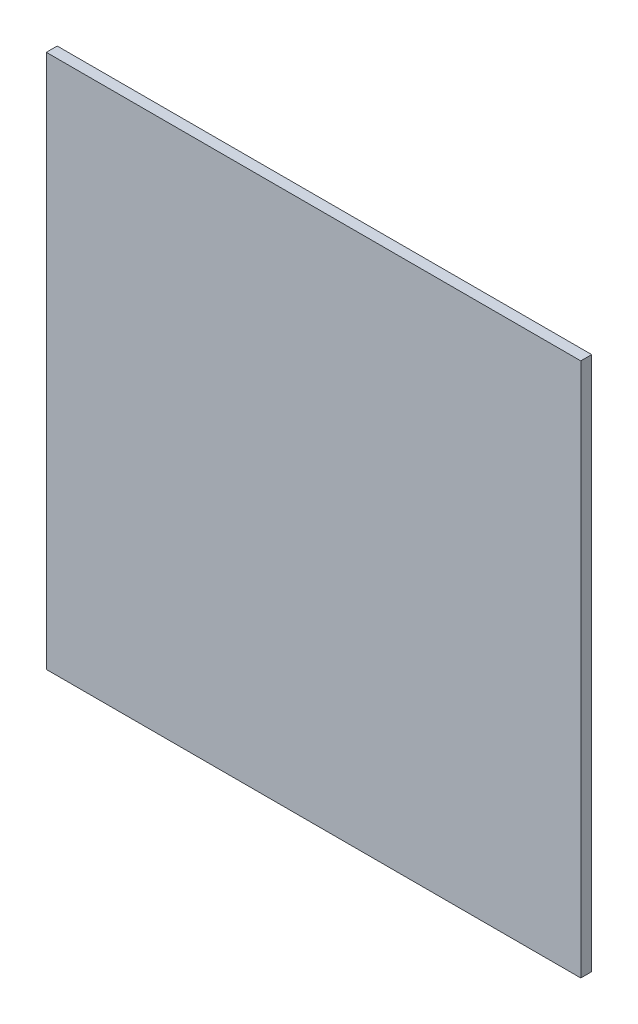
ISO-10303-21;
HEADER;
FILE_DESCRIPTION(('STEP AP214'),'2;1');
FILE_NAME('part.step','',(''),(''),'','','');
FILE_SCHEMA(('AUTOMOTIVE_DESIGN { 1 0 10303 214 1 1 1 1 }'));
ENDSEC;
DATA;
#1=APPLICATION_CONTEXT('core data for automotive mechanical design processes');
#2=APPLICATION_PROTOCOL_DEFINITION('international standard','automotive_design',2000,#1);
#3=PRODUCT_CONTEXT('',#1,'mechanical');
#4=PRODUCT('Part','Part','',(#3));
#5=PRODUCT_RELATED_PRODUCT_CATEGORY('part','',(#4));
#6=PRODUCT_DEFINITION_FORMATION('','',#4);
#7=PRODUCT_DEFINITION_CONTEXT('part definition',#1,'design');
#8=PRODUCT_DEFINITION('design','',#6,#7);
#9=PRODUCT_DEFINITION_SHAPE('','',#8);
#10=(LENGTH_UNIT() NAMED_UNIT(*) SI_UNIT(.MILLI.,.METRE.));
#11=(NAMED_UNIT(*) PLANE_ANGLE_UNIT() SI_UNIT($,.RADIAN.));
#12=(NAMED_UNIT(*) SI_UNIT($,.STERADIAN.) SOLID_ANGLE_UNIT());
#13=UNCERTAINTY_MEASURE_WITH_UNIT(LENGTH_MEASURE(1.E-05),#10,'distance_accuracy_value','');
#14=(GEOMETRIC_REPRESENTATION_CONTEXT(3) GLOBAL_UNCERTAINTY_ASSIGNED_CONTEXT((#13)) GLOBAL_UNIT_ASSIGNED_CONTEXT((#10,
#11,#12)) REPRESENTATION_CONTEXT('',''));
#15=CARTESIAN_POINT('',(0.,0.,0.));
#16=DIRECTION('',(0.,0.,1.));
#17=DIRECTION('',(1.,0.,0.));
#18=AXIS2_PLACEMENT_3D('',#15,#16,#17);
#19=CARTESIAN_POINT('',(2.45,-2.45,0.1));
#20=DIRECTION('',(-1.,0.,0.));
#21=DIRECTION('',(0.,0.,1.));
#22=AXIS2_PLACEMENT_3D('',#19,#20,#21);
#23=PLANE('',#22);
#24=DIRECTION('',(0.,1.,0.));
#25=VECTOR('',#24,1.);
#26=CARTESIAN_POINT('',(2.45,-2.45,0.));
#27=LINE('',#26,#25);
#28=CARTESIAN_POINT('',(2.45,-2.45,0.));
#29=VERTEX_POINT('',#28);
#30=CARTESIAN_POINT('',(2.45,2.45,0.));
#31=VERTEX_POINT('',#30);
#32=EDGE_CURVE('E97',#29,#31,#27,.T.);
#33=ORIENTED_EDGE('',*,*,#32,.T.);
#34=DIRECTION('',(0.,0.,-1.));
#35=VECTOR('',#34,1.);
#36=CARTESIAN_POINT('',(2.45,2.45,0.1));
#37=LINE('',#36,#35);
#38=CARTESIAN_POINT('',(2.45,2.45,0.1));
#39=VERTEX_POINT('',#38);
#40=EDGE_CURVE('E11',#39,#31,#37,.T.);
#41=ORIENTED_EDGE('',*,*,#40,.F.);
#42=DIRECTION('',(0.,1.,0.));
#43=VECTOR('',#42,1.);
#44=CARTESIAN_POINT('',(2.45,-2.45,0.1));
#45=LINE('',#44,#43);
#46=CARTESIAN_POINT('',(2.45,-2.45,0.1));
#47=VERTEX_POINT('',#46);
#48=EDGE_CURVE('E85',#47,#39,#45,.T.);
#49=ORIENTED_EDGE('',*,*,#48,.F.);
#50=DIRECTION('',(0.,0.,-1.));
#51=VECTOR('',#50,1.);
#52=CARTESIAN_POINT('',(2.45,-2.45,0.1));
#53=LINE('',#52,#51);
#54=EDGE_CURVE('E93',#47,#29,#53,.T.);
#55=ORIENTED_EDGE('',*,*,#54,.T.);
#56=EDGE_LOOP('',(#33,#41,#49,#55));
#57=FACE_BOUND('',#56,.T.);
#58=ADVANCED_FACE('F34',(#57),#23,.F.);
#59=CARTESIAN_POINT('',(-2.45,2.45,0.1));
#60=DIRECTION('',(0.,-1.,0.));
#61=DIRECTION('',(0.,0.,-1.));
#62=AXIS2_PLACEMENT_3D('',#59,#60,#61);
#63=PLANE('',#62);
#64=DIRECTION('',(-1.,0.,0.));
#65=VECTOR('',#64,1.);
#66=CARTESIAN_POINT('',(-2.45,2.45,0.));
#67=LINE('',#66,#65);
#68=CARTESIAN_POINT('',(-2.45,2.45,0.));
#69=VERTEX_POINT('',#68);
#70=EDGE_CURVE('E89',#31,#69,#67,.T.);
#71=ORIENTED_EDGE('',*,*,#70,.T.);
#72=DIRECTION('',(0.,0.,-1.));
#73=VECTOR('',#72,1.);
#74=CARTESIAN_POINT('',(-2.45,2.45,0.1));
#75=LINE('',#74,#73);
#76=CARTESIAN_POINT('',(-2.45,2.45,0.1));
#77=VERTEX_POINT('',#76);
#78=EDGE_CURVE('E42',#77,#69,#75,.T.);
#79=ORIENTED_EDGE('',*,*,#78,.F.);
#80=DIRECTION('',(-1.,0.,0.));
#81=VECTOR('',#80,1.);
#82=CARTESIAN_POINT('',(-2.45,2.45,0.1));
#83=LINE('',#82,#81);
#84=EDGE_CURVE('E80',#39,#77,#83,.T.);
#85=ORIENTED_EDGE('',*,*,#84,.F.);
#86=ORIENTED_EDGE('',*,*,#40,.T.);
#87=EDGE_LOOP('',(#71,#79,#85,#86));
#88=FACE_BOUND('',#87,.T.);
#89=ADVANCED_FACE('F88',(#88),#63,.F.);
#90=CARTESIAN_POINT('',(-2.45,-2.45,0.1));
#91=DIRECTION('',(1.,0.,0.));
#92=DIRECTION('',(0.,0.,-1.));
#93=AXIS2_PLACEMENT_3D('',#90,#91,#92);
#94=PLANE('',#93);
#95=DIRECTION('',(0.,-1.,0.));
#96=VECTOR('',#95,1.);
#97=CARTESIAN_POINT('',(-2.45,-2.45,0.));
#98=LINE('',#97,#96);
#99=CARTESIAN_POINT('',(-2.45,-2.45,0.));
#100=VERTEX_POINT('',#99);
#101=EDGE_CURVE('E67',#69,#100,#98,.T.);
#102=ORIENTED_EDGE('',*,*,#101,.T.);
#103=DIRECTION('',(0.,0.,-1.));
#104=VECTOR('',#103,1.);
#105=CARTESIAN_POINT('',(-2.45,-2.45,0.1));
#106=LINE('',#105,#104);
#107=CARTESIAN_POINT('',(-2.45,-2.45,0.1));
#108=VERTEX_POINT('',#107);
#109=EDGE_CURVE('E90',#108,#100,#106,.T.);
#110=ORIENTED_EDGE('',*,*,#109,.F.);
#111=DIRECTION('',(0.,-1.,0.));
#112=VECTOR('',#111,1.);
#113=CARTESIAN_POINT('',(-2.45,-2.45,0.1));
#114=LINE('',#113,#112);
#115=EDGE_CURVE('E83',#77,#108,#114,.T.);
#116=ORIENTED_EDGE('',*,*,#115,.F.);
#117=ORIENTED_EDGE('',*,*,#78,.T.);
#118=EDGE_LOOP('',(#102,#110,#116,#117));
#119=FACE_BOUND('',#118,.T.);
#120=ADVANCED_FACE('F91',(#119),#94,.F.);
#121=CARTESIAN_POINT('',(-2.45,-2.45,0.1));
#122=DIRECTION('',(0.,1.,0.));
#123=DIRECTION('',(0.,0.,1.));
#124=AXIS2_PLACEMENT_3D('',#121,#122,#123);
#125=PLANE('',#124);
#126=DIRECTION('',(1.,0.,0.));
#127=VECTOR('',#126,1.);
#128=CARTESIAN_POINT('',(-2.45,-2.45,0.));
#129=LINE('',#128,#127);
#130=EDGE_CURVE('E73',#100,#29,#129,.T.);
#131=ORIENTED_EDGE('',*,*,#130,.T.);
#132=ORIENTED_EDGE('',*,*,#54,.F.);
#133=DIRECTION('',(1.,0.,0.));
#134=VECTOR('',#133,1.);
#135=CARTESIAN_POINT('',(-2.45,-2.45,0.1));
#136=LINE('',#135,#134);
#137=EDGE_CURVE('E50',#108,#47,#136,.T.);
#138=ORIENTED_EDGE('',*,*,#137,.F.);
#139=ORIENTED_EDGE('',*,*,#109,.T.);
#140=EDGE_LOOP('',(#131,#132,#138,#139));
#141=FACE_BOUND('',#140,.T.);
#142=ADVANCED_FACE('F104',(#141),#125,.F.);
#143=CARTESIAN_POINT('',(0.,0.,0.1));
#144=DIRECTION('',(0.,0.,-1.));
#145=DIRECTION('',(-1.,0.,0.));
#146=AXIS2_PLACEMENT_3D('',#143,#144,#145);
#147=PLANE('',#146);
#148=ORIENTED_EDGE('',*,*,#48,.T.);
#149=ORIENTED_EDGE('',*,*,#84,.T.);
#150=ORIENTED_EDGE('',*,*,#115,.T.);
#151=ORIENTED_EDGE('',*,*,#137,.T.);
#152=EDGE_LOOP('',(#148,#149,#150,#151));
#153=FACE_BOUND('',#152,.T.);
#154=ADVANCED_FACE('F81',(#153),#147,.F.);
#155=CARTESIAN_POINT('',(0.,0.,0.));
#156=DIRECTION('',(0.,0.,-1.));
#157=DIRECTION('',(-1.,0.,0.));
#158=AXIS2_PLACEMENT_3D('',#155,#156,#157);
#159=PLANE('',#158);
#160=ORIENTED_EDGE('',*,*,#32,.F.);
#161=ORIENTED_EDGE('',*,*,#130,.F.);
#162=ORIENTED_EDGE('',*,*,#101,.F.);
#163=ORIENTED_EDGE('',*,*,#70,.F.);
#164=EDGE_LOOP('',(#160,#161,#162,#163));
#165=FACE_BOUND('',#164,.T.);
#166=ADVANCED_FACE('F107',(#165),#159,.T.);
#167=CLOSED_SHELL('',(#58,#89,#120,#142,#154,#166));
#168=MANIFOLD_SOLID_BREP('B2',#167);
#169=ADVANCED_BREP_SHAPE_REPRESENTATION('',(#18,#168),#14);
#170=SHAPE_DEFINITION_REPRESENTATION(#9,#169);
ENDSEC;
END-ISO-10303-21;
